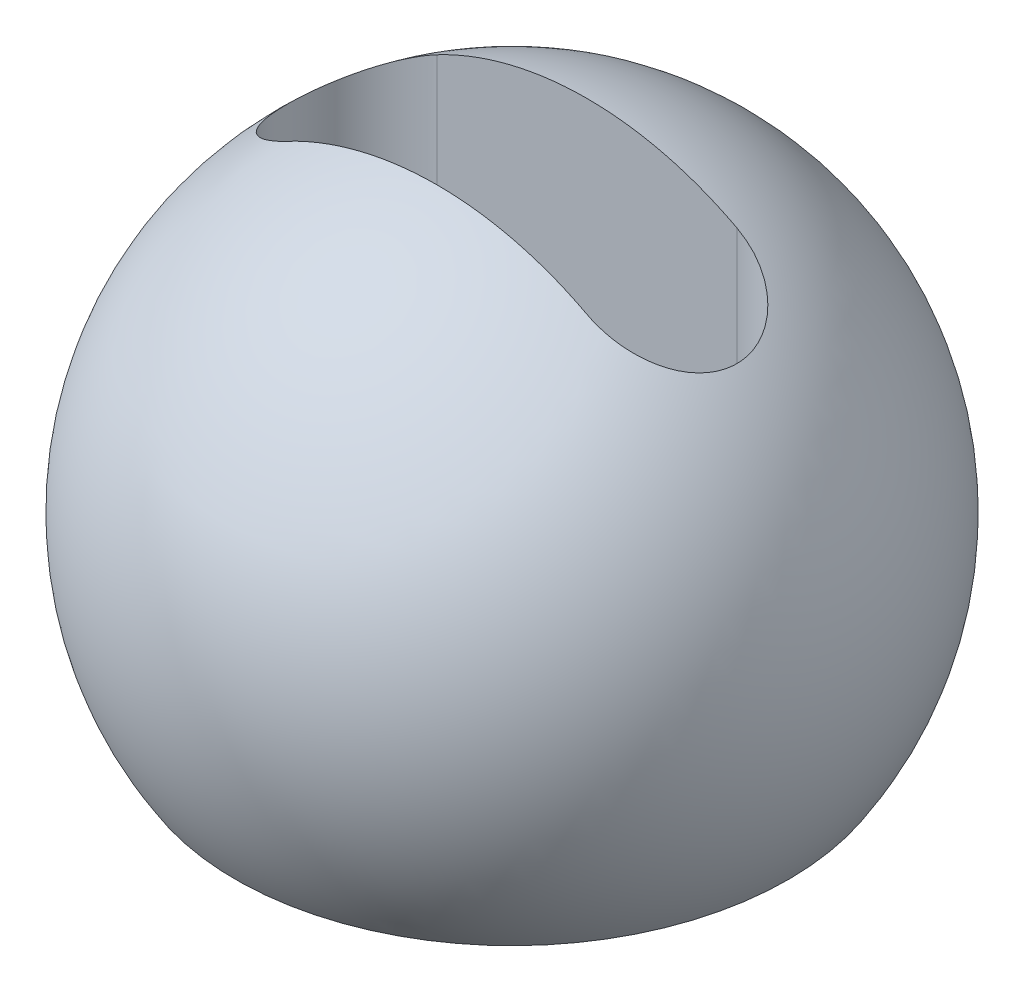
ISO-10303-21;
HEADER;
FILE_DESCRIPTION(('STEP AP214'),'2;1');
FILE_NAME('part.step','',(''),(''),'','','');
FILE_SCHEMA(('AUTOMOTIVE_DESIGN { 1 0 10303 214 1 1 1 1 }'));
ENDSEC;
DATA;
#1=APPLICATION_CONTEXT('core data for automotive mechanical design processes');
#2=APPLICATION_PROTOCOL_DEFINITION('international standard','automotive_design',2000,#1);
#3=PRODUCT_CONTEXT('',#1,'mechanical');
#4=PRODUCT('Part','Part','',(#3));
#5=PRODUCT_RELATED_PRODUCT_CATEGORY('part','',(#4));
#6=PRODUCT_DEFINITION_FORMATION('','',#4);
#7=PRODUCT_DEFINITION_CONTEXT('part definition',#1,'design');
#8=PRODUCT_DEFINITION('design','',#6,#7);
#9=PRODUCT_DEFINITION_SHAPE('','',#8);
#10=(LENGTH_UNIT() NAMED_UNIT(*) SI_UNIT(.MILLI.,.METRE.));
#11=(NAMED_UNIT(*) PLANE_ANGLE_UNIT() SI_UNIT($,.RADIAN.));
#12=(NAMED_UNIT(*) SI_UNIT($,.STERADIAN.) SOLID_ANGLE_UNIT());
#13=UNCERTAINTY_MEASURE_WITH_UNIT(LENGTH_MEASURE(1.E-05),#10,'distance_accuracy_value','');
#14=(GEOMETRIC_REPRESENTATION_CONTEXT(3) GLOBAL_UNCERTAINTY_ASSIGNED_CONTEXT((#13)) GLOBAL_UNIT_ASSIGNED_CONTEXT((#10,
#11,#12)) REPRESENTATION_CONTEXT('',''));
#15=CARTESIAN_POINT('',(0.,0.,0.));
#16=DIRECTION('',(0.,0.,1.));
#17=DIRECTION('',(1.,0.,0.));
#18=AXIS2_PLACEMENT_3D('',#15,#16,#17);
#19=CARTESIAN_POINT('',(0.,0.,0.));
#20=DIRECTION('',(0.,-1.,0.));
#21=DIRECTION('',(1.,0.,0.));
#22=AXIS2_PLACEMENT_3D('',#19,#20,#21);
#23=SPHERICAL_SURFACE('',#22,55.);
#24=CARTESIAN_POINT('',(2.46330733588707E-13,-30.,0.));
#25=DIRECTION('',(0.,-1.,0.));
#26=DIRECTION('',(0.,0.,-1.));
#27=AXIS2_PLACEMENT_3D('',#24,#25,#26);
#28=CIRCLE('',#27,46.0977222864642);
#29=CARTESIAN_POINT('',(2.46330733588707E-13,-30.,-46.0977222864642));
#30=VERTEX_POINT('',#29);
#31=EDGE_CURVE('E126',#30,#30,#28,.T.);
#32=ORIENTED_EDGE('',*,*,#31,.F.);
#33=EDGE_LOOP('',(#32));
#34=FACE_BOUND('',#33,.T.);
#35=CARTESIAN_POINT('',(0.,0.,12.5));
#36=DIRECTION('',(0.,0.,-1.));
#37=DIRECTION('',(-1.,0.,0.));
#38=AXIS2_PLACEMENT_3D('',#35,#36,#37);
#39=CIRCLE('',#38,53.5607132140714);
#40=CARTESIAN_POINT('',(25.,47.368238303741,12.5));
#41=VERTEX_POINT('',#40);
#42=CARTESIAN_POINT('',(-25.,47.368238303741,12.5));
#43=VERTEX_POINT('',#42);
#44=EDGE_CURVE('E54',#41,#43,#39,.F.);
#45=ORIENTED_EDGE('',*,*,#44,.T.);
#46=CARTESIAN_POINT('',(-24.9998,47.3683438595862,12.4999999984));
#47=CARTESIAN_POINT('',(-25.3950289693765,47.1597642636726,12.500013378463));
#48=CARTESIAN_POINT('',(-25.7896651663704,46.9500927277301,12.4812686460262));
#49=CARTESIAN_POINT('',(-26.5750447866544,46.5300067836024,12.4066430148472));
#50=CARTESIAN_POINT('',(-26.9657879692828,46.3195923305667,12.3507598345288));
#51=CARTESIAN_POINT('',(-27.7416789214404,45.8989161790762,12.2020354588137));
#52=CARTESIAN_POINT('',(-28.1268085796128,45.6886564530053,12.1090941465104));
#53=CARTESIAN_POINT('',(-28.88764904255,45.2704235653399,11.8866843211306));
#54=CARTESIAN_POINT('',(-29.2633600179975,45.0624503623481,11.7572164704994));
#55=CARTESIAN_POINT('',(-30.0030041733786,44.6502219917834,11.4620534331192));
#56=CARTESIAN_POINT('',(-30.3669242277365,44.4459710714541,11.2963193651608));
#57=CARTESIAN_POINT('',(-31.0796851626382,44.0432320042578,10.9292319995392));
#58=CARTESIAN_POINT('',(-31.4285266808594,43.8447436138079,10.7278802100015));
#59=CARTESIAN_POINT('',(-32.107957304081,43.4556092005808,10.2902929117788));
#60=CARTESIAN_POINT('',(-32.4385561957848,43.2649589870969,10.0540763620957));
#61=CARTESIAN_POINT('',(-33.0784973483729,42.8935846727495,9.54748095642508));
#62=CARTESIAN_POINT('',(-33.3878412503509,42.7128598057687,9.27710474248458));
#63=CARTESIAN_POINT('',(-33.9656303771121,42.3732902230566,8.7189374115976));
#64=CARTESIAN_POINT('',(-34.2353867286182,42.2137895417961,8.43290491801024));
#65=CARTESIAN_POINT('',(-34.7497285802152,41.9080772298708,7.83256146664591));
#66=CARTESIAN_POINT('',(-34.994318630708,41.7618631973638,7.51825564039448));
#67=CARTESIAN_POINT('',(-35.4549893111523,41.4851740220948,6.86318395980831));
#68=CARTESIAN_POINT('',(-35.6710921003922,41.3546866529418,6.52243900330976));
#69=CARTESIAN_POINT('',(-35.971378842018,41.172621371213,5.99333076048439));
#70=CARTESIAN_POINT('',(-36.0674929804532,41.1142127385026,5.81397078772995));
#71=CARTESIAN_POINT('',(-36.2514389712779,41.0022095217677,5.44947790881605));
#72=CARTESIAN_POINT('',(-36.3392671826246,40.9486170545727,5.26434251190218));
#73=CARTESIAN_POINT('',(-36.5660139367723,40.8100108243329,4.75412687138675));
#74=CARTESIAN_POINT('',(-36.6964401849493,40.7300026273686,4.42383620417932));
#75=CARTESIAN_POINT('',(-36.9295074622401,40.5866945226055,3.75018347835421));
#76=CARTESIAN_POINT('',(-37.0321547359472,40.5233908597795,3.40682437729257));
#77=CARTESIAN_POINT('',(-37.2079402089792,40.4147985534742,2.71018446911028));
#78=CARTESIAN_POINT('',(-37.2811071802328,40.3694923456072,2.35691369753482));
#79=CARTESIAN_POINT('',(-37.3967504115159,40.2978135527403,1.64350436734645));
#80=CARTESIAN_POINT('',(-37.4392307931067,40.2714384250821,1.28336673770297));
#81=CARTESIAN_POINT('',(-37.4889843784752,40.24053890042,0.610475842307387));
#82=CARTESIAN_POINT('',(-37.5003476332282,40.233476286679,0.298132963383978));
#83=CARTESIAN_POINT('',(-37.4996362800584,40.2339184062859,-0.326493889015558));
#84=CARTESIAN_POINT('',(-37.487564401588,40.2414214431958,-0.638777865115508));
#85=CARTESIAN_POINT('',(-37.4401614918996,40.2708596737393,-1.26082256071334));
#86=CARTESIAN_POINT('',(-37.4048346938911,40.292792240693,-1.57058372906294));
#87=CARTESIAN_POINT('',(-37.3114189049761,40.3507111562303,-2.18531936293857));
#88=CARTESIAN_POINT('',(-37.2533296438849,40.3866976716307,-2.49029377160227));
#89=CARTESIAN_POINT('',(-37.1178080930092,40.4704988507296,-3.08176003063804));
#90=CARTESIAN_POINT('',(-37.0411989722627,40.5178094732042,-3.36851298520746));
#91=CARTESIAN_POINT('',(-36.8685405657699,40.6242021249774,-3.93383973315743));
#92=CARTESIAN_POINT('',(-36.7724920611217,40.683283681304,-4.21241385465859));
#93=CARTESIAN_POINT('',(-36.5619935347121,40.8124305667798,-4.75986467326286));
#94=CARTESIAN_POINT('',(-36.4475441882311,40.8824954928551,-5.0287417257891));
#95=CARTESIAN_POINT('',(-36.2013289938941,41.032781969862,-5.55561199090328));
#96=CARTESIAN_POINT('',(-36.069556572114,41.1130073761633,-5.81360102225456));
#97=CARTESIAN_POINT('',(-35.7795823844477,41.2889716225619,-6.33611413734228));
#98=CARTESIAN_POINT('',(-35.6201478619564,41.3854183910077,-6.59971555968808));
#99=CARTESIAN_POINT('',(-35.2841361282534,41.5879002179756,-7.1119915141201));
#100=CARTESIAN_POINT('',(-35.1075529265649,41.693938626212,-7.36066078057151));
#101=CARTESIAN_POINT('',(-34.738727171281,41.9145058656463,-7.84214048365999));
#102=CARTESIAN_POINT('',(-34.5464828731016,42.029035642621,-8.0749491481699));
#103=CARTESIAN_POINT('',(-34.1477698233134,42.2655355370281,-8.52399407492051));
#104=CARTESIAN_POINT('',(-33.9413006674043,42.3875058659252,-8.74022986575601));
#105=CARTESIAN_POINT('',(-33.4869118624261,42.6547132156621,-9.18346946461283));
#106=CARTESIAN_POINT('',(-33.2371472998511,42.800876454466,-9.40802635683791));
#107=CARTESIAN_POINT('',(-32.7229938915918,43.1001472929758,-9.83447590110778));
#108=CARTESIAN_POINT('',(-32.4586074192137,43.253253764992,-10.0363722152059));
#109=CARTESIAN_POINT('',(-31.9167049081138,43.5653431347406,-10.4172434938841));
#110=CARTESIAN_POINT('',(-31.6391779050904,43.7243309146848,-10.5961988382731));
#111=CARTESIAN_POINT('',(-31.072864507438,44.0469386372088,-10.9306211244255));
#112=CARTESIAN_POINT('',(-30.7840767303709,44.2105591478501,-11.0860851707668));
#113=CARTESIAN_POINT('',(-30.1576848808262,44.5634478676207,-11.3923433868391));
#114=CARTESIAN_POINT('',(-29.818707297909,44.7532261162724,-11.5397489355933));
#115=CARTESIAN_POINT('',(-29.1307292020102,45.1359075429769,-11.8035067571806));
#116=CARTESIAN_POINT('',(-28.781731057303,45.3288099780323,-11.91986630164));
#117=CARTESIAN_POINT('',(-28.0761465148011,45.716301053875,-12.1211302521793));
#118=CARTESIAN_POINT('',(-27.7195672698702,45.9108880107391,-12.2060630285527));
#119=CARTESIAN_POINT('',(-27.0008031724891,46.300624045967,-12.344254748257));
#120=CARTESIAN_POINT('',(-26.6386209665309,46.4957728255217,-12.3975282034297));
#121=CARTESIAN_POINT('',(-26.0629715150889,46.8039987006191,-12.4565411915852));
#122=CARTESIAN_POINT('',(-25.8506409113552,46.9172753383913,-12.4728420939186));
#123=CARTESIAN_POINT('',(-25.4255354966519,47.1432496400941,-12.4945641375479));
#124=CARTESIAN_POINT('',(-25.2127618660943,47.2559479254759,-12.5000019236242));
#125=CARTESIAN_POINT('',(-24.9998,47.3683438595862,-12.4999999984));
#126=B_SPLINE_CURVE_WITH_KNOTS('',3,(#46,#47,#48,#49,#50,#51,#52,#53,#54,#55,#56,#57,#58,#59,
#60,#61,#62,#63,#64,#65,#66,#67,#68,#69,#70,#71,#72,#73,#74,#75,#76,#77,#78,#79,#80,#81,#82,#83,
#84,#85,#86,#87,#88,#89,#90,#91,#92,#93,#94,#95,#96,#97,#98,#99,#100,#101,#102,#103,#104,#105,
#106,#107,#108,#109,#110,#111,#112,#113,#114,#115,#116,#117,#118,#119,#120,#121,#122,#123,#124,
#125),.UNSPECIFIED.,.F.,.F.,(4,2,2,2,2,2,2,2,2,2,2,2,2,2,2,2,2,2,2,2,2,2,2,2,2,2,2,2,2,2,2,2,2,
2,2,2,2,2,2,4),(0.,1.34025890617384,2.68060015788771,4.02458730425454,5.36855007763706,
6.71396084259403,8.05931465380049,9.40393955626753,10.7484605235804,12.0195209631816,
13.2903511727783,14.5601869382717,15.1950515035909,15.8301937573454,16.9204999523643,
18.0105608472933,19.0995552820224,20.1884034250925,21.1251087265336,22.0617049379522,
22.998130703201,23.9345675839262,24.8352522982823,25.7359008292154,26.6365163153893,
27.537474567585,28.5049185824273,29.4727017745052,30.4405929216063,31.4085115895664,
32.5062769134766,33.6038645772679,34.7023847741707,35.8010402590281,37.0462347116109,
38.2911372569619,39.5349132175195,40.7781186216318,41.5015224183423,42.2238169421083),.UNSPECIFIED.);
#127=CARTESIAN_POINT('',(-25.,47.368238303741,-12.5));
#128=VERTEX_POINT('',#127);
#129=EDGE_CURVE('E11',#43,#128,#126,.T.);
#130=ORIENTED_EDGE('',*,*,#129,.T.);
#131=CARTESIAN_POINT('',(0.,0.,-12.5));
#132=DIRECTION('',(0.,0.,-1.));
#133=DIRECTION('',(-1.,0.,0.));
#134=AXIS2_PLACEMENT_3D('',#131,#132,#133);
#135=CIRCLE('',#134,53.5607132140714);
#136=CARTESIAN_POINT('',(25.,47.368238303741,-12.5));
#137=VERTEX_POINT('',#136);
#138=EDGE_CURVE('E135',#137,#128,#135,.F.);
#139=ORIENTED_EDGE('',*,*,#138,.F.);
#140=CARTESIAN_POINT('',(24.9998,47.3683438595862,-12.4999999984));
#141=CARTESIAN_POINT('',(25.3950289693765,47.1597642636726,-12.500013378463));
#142=CARTESIAN_POINT('',(25.7896651663704,46.9500927277301,-12.4812686460263));
#143=CARTESIAN_POINT('',(26.5750447866544,46.5300067836024,-12.4066430148472));
#144=CARTESIAN_POINT('',(26.9657879692828,46.3195923305667,-12.3507598345288));
#145=CARTESIAN_POINT('',(27.7416789214404,45.8989161790762,-12.2020354588137));
#146=CARTESIAN_POINT('',(28.1268085796128,45.6886564530053,-12.1090941465104));
#147=CARTESIAN_POINT('',(28.88764904255,45.2704235653399,-11.8866843211306));
#148=CARTESIAN_POINT('',(29.2633600179975,45.0624503623481,-11.7572164704994));
#149=CARTESIAN_POINT('',(30.0030041733786,44.6502219917834,-11.4620534331192));
#150=CARTESIAN_POINT('',(30.3669242277365,44.4459710714541,-11.2963193651608));
#151=CARTESIAN_POINT('',(31.0796851626382,44.0432320042578,-10.9292319995392));
#152=CARTESIAN_POINT('',(31.4285266808594,43.8447436138079,-10.7278802100016));
#153=CARTESIAN_POINT('',(32.107957304081,43.4556092005808,-10.2902929117788));
#154=CARTESIAN_POINT('',(32.4385561957848,43.2649589870969,-10.0540763620957));
#155=CARTESIAN_POINT('',(33.078497348373,42.8935846727495,-9.54748095642509));
#156=CARTESIAN_POINT('',(33.3878412503509,42.7128598057687,-9.27710474248459));
#157=CARTESIAN_POINT('',(33.9656303771122,42.3732902230566,-8.71893741159761));
#158=CARTESIAN_POINT('',(34.2353867286182,42.213789541796,-8.43290491801024));
#159=CARTESIAN_POINT('',(34.7497285802152,41.9080772298708,-7.83256146664593));
#160=CARTESIAN_POINT('',(34.994318630708,41.7618631973638,-7.5182556403945));
#161=CARTESIAN_POINT('',(35.4549893111523,41.4851740220948,-6.86318395980833));
#162=CARTESIAN_POINT('',(35.6710921003922,41.3546866529418,-6.52243900330978));
#163=CARTESIAN_POINT('',(35.971378842018,41.172621371213,-5.99333076048441));
#164=CARTESIAN_POINT('',(36.0674929804532,41.1142127385026,-5.81397078772997));
#165=CARTESIAN_POINT('',(36.2514389712779,41.0022095217677,-5.44947790881608));
#166=CARTESIAN_POINT('',(36.3392671826246,40.9486170545727,-5.2643425119022));
#167=CARTESIAN_POINT('',(36.5660139367723,40.8100108243329,-4.75412687138678));
#168=CARTESIAN_POINT('',(36.6964401849493,40.7300026273686,-4.42383620417934));
#169=CARTESIAN_POINT('',(36.9295074622401,40.5866945226055,-3.75018347835423));
#170=CARTESIAN_POINT('',(37.0321547359472,40.5233908597795,-3.40682437729259));
#171=CARTESIAN_POINT('',(37.2079402089792,40.4147985534742,-2.7101844691103));
#172=CARTESIAN_POINT('',(37.2811071802328,40.3694923456072,-2.35691369753485));
#173=CARTESIAN_POINT('',(37.3967504115159,40.2978135527403,-1.64350436734647));
#174=CARTESIAN_POINT('',(37.4392307931067,40.2714384250821,-1.28336673770299));
#175=CARTESIAN_POINT('',(37.4889843784752,40.24053890042,-0.610475842307405));
#176=CARTESIAN_POINT('',(37.5003476332282,40.233476286679,-0.298132963383996));
#177=CARTESIAN_POINT('',(37.4996362800584,40.2339184062859,0.32649388901554));
#178=CARTESIAN_POINT('',(37.487564401588,40.2414214431958,0.63877786511549));
#179=CARTESIAN_POINT('',(37.4401614918996,40.2708596737393,1.26082256071332));
#180=CARTESIAN_POINT('',(37.4048346938911,40.292792240693,1.57058372906292));
#181=CARTESIAN_POINT('',(37.3114189049761,40.3507111562302,2.18531936293855));
#182=CARTESIAN_POINT('',(37.2533296438849,40.3866976716307,2.49029377160225));
#183=CARTESIAN_POINT('',(37.1178080930092,40.4704988507296,3.08176003063802));
#184=CARTESIAN_POINT('',(37.0411989722627,40.5178094732042,3.36851298520744));
#185=CARTESIAN_POINT('',(36.8685405657699,40.6242021249774,3.93383973315741));
#186=CARTESIAN_POINT('',(36.7724920611217,40.683283681304,4.21241385465857));
#187=CARTESIAN_POINT('',(36.5619935347121,40.8124305667798,4.75986467326285));
#188=CARTESIAN_POINT('',(36.4475441882311,40.8824954928551,5.02874172578908));
#189=CARTESIAN_POINT('',(36.2013289938941,41.032781969862,5.55561199090327));
#190=CARTESIAN_POINT('',(36.069556572114,41.1130073761633,5.81360102225454));
#191=CARTESIAN_POINT('',(35.7795823844477,41.2889716225619,6.33611413734226));
#192=CARTESIAN_POINT('',(35.6201478619564,41.3854183910077,6.59971555968806));
#193=CARTESIAN_POINT('',(35.2841361282534,41.5879002179756,7.11199151412008));
#194=CARTESIAN_POINT('',(35.1075529265649,41.693938626212,7.3606607805715));
#195=CARTESIAN_POINT('',(34.7387271712811,41.9145058656463,7.84214048365997));
#196=CARTESIAN_POINT('',(34.5464828731016,42.029035642621,8.07494914816988));
#197=CARTESIAN_POINT('',(34.1477698233134,42.2655355370281,8.52399407492049));
#198=CARTESIAN_POINT('',(33.9413006674043,42.3875058659252,8.74022986575599));
#199=CARTESIAN_POINT('',(33.4869118624261,42.6547132156621,9.18346946461281));
#200=CARTESIAN_POINT('',(33.2371472998511,42.800876454466,9.40802635683789));
#201=CARTESIAN_POINT('',(32.7229938915918,43.1001472929758,9.83447590110776));
#202=CARTESIAN_POINT('',(32.4586074192137,43.253253764992,10.0363722152058));
#203=CARTESIAN_POINT('',(31.9167049081138,43.5653431347406,10.4172434938841));
#204=CARTESIAN_POINT('',(31.6391779050905,43.7243309146848,10.5961988382731));
#205=CARTESIAN_POINT('',(31.072864507438,44.0469386372088,10.9306211244255));
#206=CARTESIAN_POINT('',(30.7840767303709,44.2105591478501,11.0860851707668));
#207=CARTESIAN_POINT('',(30.1576848808262,44.5634478676207,11.3923433868391));
#208=CARTESIAN_POINT('',(29.8187072979091,44.7532261162724,11.5397489355933));
#209=CARTESIAN_POINT('',(29.1307292020102,45.1359075429769,11.8035067571806));
#210=CARTESIAN_POINT('',(28.781731057303,45.3288099780323,11.91986630164));
#211=CARTESIAN_POINT('',(28.0761465148011,45.716301053875,12.1211302521792));
#212=CARTESIAN_POINT('',(27.7195672698703,45.9108880107391,12.2060630285527));
#213=CARTESIAN_POINT('',(27.0008031724891,46.300624045967,12.344254748257));
#214=CARTESIAN_POINT('',(26.6386209665309,46.4957728255217,12.3975282034297));
#215=CARTESIAN_POINT('',(26.0629715150889,46.8039987006191,12.4565411915852));
#216=CARTESIAN_POINT('',(25.8506409113552,46.9172753383913,12.4728420939185));
#217=CARTESIAN_POINT('',(25.4255354966519,47.1432496400941,12.4945641375479));
#218=CARTESIAN_POINT('',(25.2127618660943,47.2559479254759,12.5000019236242));
#219=CARTESIAN_POINT('',(24.9998,47.3683438595862,12.4999999984));
#220=B_SPLINE_CURVE_WITH_KNOTS('',3,(#140,#141,#142,#143,#144,#145,#146,#147,#148,#149,#150,
#151,#152,#153,#154,#155,#156,#157,#158,#159,#160,#161,#162,#163,#164,#165,#166,#167,#168,#169,
#170,#171,#172,#173,#174,#175,#176,#177,#178,#179,#180,#181,#182,#183,#184,#185,#186,#187,#188,
#189,#190,#191,#192,#193,#194,#195,#196,#197,#198,#199,#200,#201,#202,#203,#204,#205,#206,#207,
#208,#209,#210,#211,#212,#213,#214,#215,#216,#217,#218,#219),.UNSPECIFIED.,.F.,.F.,(4,2,2,2,2,2,
2,2,2,2,2,2,2,2,2,2,2,2,2,2,2,2,2,2,2,2,2,2,2,2,2,2,2,2,2,2,2,2,2,4),(0.,1.34025890617384,
2.68060015788772,4.02458730425454,5.36855007763707,6.71396084259404,8.0593146538005,
9.40393955626753,10.7484605235804,12.0195209631816,13.2903511727783,14.5601869382716,
15.1950515035909,15.8301937573454,16.9204999523643,18.0105608472933,19.0995552820224,
20.1884034250925,21.1251087265336,22.0617049379522,22.998130703201,23.9345675839262,
24.8352522982823,25.7359008292153,26.6365163153893,27.537474567585,28.5049185824272,
29.4727017745052,30.4405929216063,31.4085115895664,32.5062769134765,33.6038645772679,
34.7023847741707,35.8010402590281,37.0462347116109,38.2911372569619,39.5349132175195,
40.7781186216318,41.5015224183423,42.2238169421083),.UNSPECIFIED.);
#221=EDGE_CURVE('E134',#137,#41,#220,.T.);
#222=ORIENTED_EDGE('',*,*,#221,.T.);
#223=EDGE_LOOP('',(#45,#130,#139,#222));
#224=FACE_BOUND('',#223,.T.);
#225=ADVANCED_FACE('F44',(#34,#224),#23,.T.);
#226=CARTESIAN_POINT('',(46.0977222864644,-30.,0.));
#227=DIRECTION('',(0.,-1.,0.));
#228=DIRECTION('',(0.,0.,-1.));
#229=AXIS2_PLACEMENT_3D('',#226,#227,#228);
#230=PLANE('',#229);
#231=CARTESIAN_POINT('',(-25.,-30.,0.));
#232=DIRECTION('',(0.,-1.,0.));
#233=DIRECTION('',(0.,0.,-1.));
#234=AXIS2_PLACEMENT_3D('',#231,#232,#233);
#235=CIRCLE('',#234,12.5);
#236=CARTESIAN_POINT('',(-25.,-30.,-12.5));
#237=VERTEX_POINT('',#236);
#238=EDGE_CURVE('E47',#237,#237,#235,.T.);
#239=ORIENTED_EDGE('',*,*,#238,.F.);
#240=EDGE_LOOP('',(#239));
#241=FACE_BOUND('',#240,.T.);
#242=CARTESIAN_POINT('',(25.,-30.,0.));
#243=DIRECTION('',(0.,-1.,0.));
#244=DIRECTION('',(0.,0.,-1.));
#245=AXIS2_PLACEMENT_3D('',#242,#243,#244);
#246=CIRCLE('',#245,12.5);
#247=CARTESIAN_POINT('',(25.,-30.,-12.5));
#248=VERTEX_POINT('',#247);
#249=EDGE_CURVE('E117',#248,#248,#246,.T.);
#250=ORIENTED_EDGE('',*,*,#249,.F.);
#251=EDGE_LOOP('',(#250));
#252=FACE_BOUND('',#251,.T.);
#253=ORIENTED_EDGE('',*,*,#31,.T.);
#254=EDGE_LOOP('',(#253));
#255=FACE_BOUND('',#254,.T.);
#256=ADVANCED_FACE('F152',(#241,#252,#255),#230,.T.);
#257=CARTESIAN_POINT('',(-25.,95.,0.));
#258=DIRECTION('',(0.,-1.,0.));
#259=DIRECTION('',(0.,0.,-1.));
#260=AXIS2_PLACEMENT_3D('',#257,#258,#259);
#261=CYLINDRICAL_SURFACE('',#260,12.5);
#262=DIRECTION('',(0.,-1.,0.));
#263=VECTOR('',#262,1.);
#264=CARTESIAN_POINT('',(-25.,95.,12.5));
#265=LINE('',#264,#263);
#266=CARTESIAN_POINT('',(-25.,15.,12.5));
#267=VERTEX_POINT('',#266);
#268=EDGE_CURVE('E110',#43,#267,#265,.T.);
#269=ORIENTED_EDGE('',*,*,#268,.T.);
#270=CARTESIAN_POINT('',(-25.,15.,0.));
#271=DIRECTION('',(0.,1.,0.));
#272=DIRECTION('',(0.,0.,1.));
#273=AXIS2_PLACEMENT_3D('',#270,#271,#272);
#274=CIRCLE('',#273,12.5);
#275=CARTESIAN_POINT('',(-25.,15.,-12.5));
#276=VERTEX_POINT('',#275);
#277=EDGE_CURVE('E97',#267,#276,#274,.T.);
#278=ORIENTED_EDGE('',*,*,#277,.T.);
#279=DIRECTION('',(0.,-1.,0.));
#280=VECTOR('',#279,1.);
#281=CARTESIAN_POINT('',(-25.,95.,-12.5));
#282=LINE('',#281,#280);
#283=EDGE_CURVE('E113',#128,#276,#282,.T.);
#284=ORIENTED_EDGE('',*,*,#283,.F.);
#285=ORIENTED_EDGE('',*,*,#129,.F.);
#286=EDGE_LOOP('',(#269,#278,#284,#285));
#287=FACE_BOUND('',#286,.T.);
#288=ORIENTED_EDGE('',*,*,#238,.T.);
#289=EDGE_LOOP('',(#288));
#290=FACE_BOUND('',#289,.T.);
#291=ADVANCED_FACE('F151',(#287,#290),#261,.F.);
#292=CARTESIAN_POINT('',(-25.,95.,12.5));
#293=DIRECTION('',(0.,0.,-1.));
#294=DIRECTION('',(-1.,0.,0.));
#295=AXIS2_PLACEMENT_3D('',#292,#293,#294);
#296=PLANE('',#295);
#297=DIRECTION('',(0.,-1.,0.));
#298=VECTOR('',#297,1.);
#299=CARTESIAN_POINT('',(25.,95.,12.5));
#300=LINE('',#299,#298);
#301=CARTESIAN_POINT('',(25.,15.,12.5));
#302=VERTEX_POINT('',#301);
#303=EDGE_CURVE('E91',#41,#302,#300,.T.);
#304=ORIENTED_EDGE('',*,*,#303,.T.);
#305=DIRECTION('',(1.,0.,0.));
#306=VECTOR('',#305,1.);
#307=CARTESIAN_POINT('',(-25.,15.,12.5));
#308=LINE('',#307,#306);
#309=EDGE_CURVE('E102',#267,#302,#308,.T.);
#310=ORIENTED_EDGE('',*,*,#309,.F.);
#311=ORIENTED_EDGE('',*,*,#268,.F.);
#312=ORIENTED_EDGE('',*,*,#44,.F.);
#313=EDGE_LOOP('',(#304,#310,#311,#312));
#314=FACE_BOUND('',#313,.T.);
#315=ADVANCED_FACE('F103',(#314),#296,.T.);
#316=CARTESIAN_POINT('',(25.,95.,0.));
#317=DIRECTION('',(0.,-1.,0.));
#318=DIRECTION('',(0.,0.,-1.));
#319=AXIS2_PLACEMENT_3D('',#316,#317,#318);
#320=CYLINDRICAL_SURFACE('',#319,12.5);
#321=DIRECTION('',(0.,-1.,0.));
#322=VECTOR('',#321,1.);
#323=CARTESIAN_POINT('',(25.,95.,-12.5));
#324=LINE('',#323,#322);
#325=CARTESIAN_POINT('',(25.,15.,-12.5));
#326=VERTEX_POINT('',#325);
#327=EDGE_CURVE('E62',#137,#326,#324,.T.);
#328=ORIENTED_EDGE('',*,*,#327,.T.);
#329=CARTESIAN_POINT('',(25.,15.,0.));
#330=DIRECTION('',(0.,1.,0.));
#331=DIRECTION('',(0.,0.,1.));
#332=AXIS2_PLACEMENT_3D('',#329,#330,#331);
#333=CIRCLE('',#332,12.5);
#334=EDGE_CURVE('E90',#326,#302,#333,.T.);
#335=ORIENTED_EDGE('',*,*,#334,.T.);
#336=ORIENTED_EDGE('',*,*,#303,.F.);
#337=ORIENTED_EDGE('',*,*,#221,.F.);
#338=EDGE_LOOP('',(#328,#335,#336,#337));
#339=FACE_BOUND('',#338,.T.);
#340=ORIENTED_EDGE('',*,*,#249,.T.);
#341=EDGE_LOOP('',(#340));
#342=FACE_BOUND('',#341,.T.);
#343=ADVANCED_FACE('F93',(#339,#342),#320,.F.);
#344=CARTESIAN_POINT('',(-25.,95.,-12.5));
#345=DIRECTION('',(0.,0.,-1.));
#346=DIRECTION('',(-1.,0.,0.));
#347=AXIS2_PLACEMENT_3D('',#344,#345,#346);
#348=PLANE('',#347);
#349=ORIENTED_EDGE('',*,*,#138,.T.);
#350=ORIENTED_EDGE('',*,*,#283,.T.);
#351=DIRECTION('',(1.,0.,0.));
#352=VECTOR('',#351,1.);
#353=CARTESIAN_POINT('',(-25.,15.,-12.5));
#354=LINE('',#353,#352);
#355=EDGE_CURVE('E112',#276,#326,#354,.T.);
#356=ORIENTED_EDGE('',*,*,#355,.T.);
#357=ORIENTED_EDGE('',*,*,#327,.F.);
#358=EDGE_LOOP('',(#349,#350,#356,#357));
#359=FACE_BOUND('',#358,.T.);
#360=ADVANCED_FACE('F150',(#359),#348,.F.);
#361=CARTESIAN_POINT('',(-25.,15.,0.));
#362=DIRECTION('',(0.,1.,0.));
#363=DIRECTION('',(0.,0.,1.));
#364=AXIS2_PLACEMENT_3D('',#361,#362,#363);
#365=PLANE('',#364);
#366=ORIENTED_EDGE('',*,*,#277,.F.);
#367=ORIENTED_EDGE('',*,*,#309,.T.);
#368=ORIENTED_EDGE('',*,*,#334,.F.);
#369=ORIENTED_EDGE('',*,*,#355,.F.);
#370=EDGE_LOOP('',(#366,#367,#368,#369));
#371=FACE_BOUND('',#370,.T.);
#372=ADVANCED_FACE('F108',(#371),#365,.T.);
#373=CLOSED_SHELL('',(#225,#256,#291,#315,#343,#360,#372));
#374=MANIFOLD_SOLID_BREP('B2',#373);
#375=ADVANCED_BREP_SHAPE_REPRESENTATION('',(#18,#374),#14);
#376=SHAPE_DEFINITION_REPRESENTATION(#9,#375);
ENDSEC;
END-ISO-10303-21;
